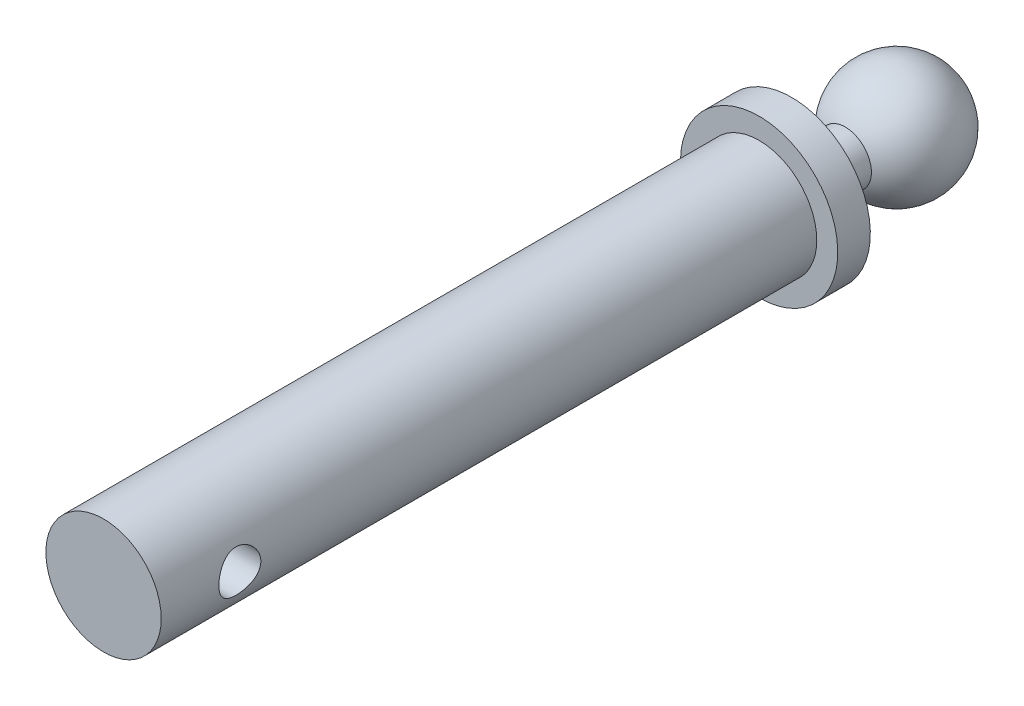
ISO-10303-21;
HEADER;
FILE_DESCRIPTION(('STEP AP214'),'2;1');
FILE_NAME('part.step','',(''),(''),'','','');
FILE_SCHEMA(('AUTOMOTIVE_DESIGN { 1 0 10303 214 1 1 1 1 }'));
ENDSEC;
DATA;
#1=APPLICATION_CONTEXT('core data for automotive mechanical design processes');
#2=APPLICATION_PROTOCOL_DEFINITION('international standard','automotive_design',2000,#1);
#3=PRODUCT_CONTEXT('',#1,'mechanical');
#4=PRODUCT('Part','Part','',(#3));
#5=PRODUCT_RELATED_PRODUCT_CATEGORY('part','',(#4));
#6=PRODUCT_DEFINITION_FORMATION('','',#4);
#7=PRODUCT_DEFINITION_CONTEXT('part definition',#1,'design');
#8=PRODUCT_DEFINITION('design','',#6,#7);
#9=PRODUCT_DEFINITION_SHAPE('','',#8);
#10=(LENGTH_UNIT() NAMED_UNIT(*) SI_UNIT(.MILLI.,.METRE.));
#11=(NAMED_UNIT(*) PLANE_ANGLE_UNIT() SI_UNIT($,.RADIAN.));
#12=(NAMED_UNIT(*) SI_UNIT($,.STERADIAN.) SOLID_ANGLE_UNIT());
#13=UNCERTAINTY_MEASURE_WITH_UNIT(LENGTH_MEASURE(1.E-05),#10,'distance_accuracy_value','');
#14=(GEOMETRIC_REPRESENTATION_CONTEXT(3) GLOBAL_UNCERTAINTY_ASSIGNED_CONTEXT((#13)) GLOBAL_UNIT_ASSIGNED_CONTEXT((#10,
#11,#12)) REPRESENTATION_CONTEXT('',''));
#15=CARTESIAN_POINT('',(0.,0.,0.));
#16=DIRECTION('',(0.,0.,1.));
#17=DIRECTION('',(1.,0.,0.));
#18=AXIS2_PLACEMENT_3D('',#15,#16,#17);
#19=CARTESIAN_POINT('',(15.999886669716,0.,-15.));
#20=DIRECTION('',(0.,0.,1.));
#21=DIRECTION('',(1.,0.,0.));
#22=AXIS2_PLACEMENT_3D('',#19,#20,#21);
#23=CYLINDRICAL_SURFACE('',#22,5.49734160658599);
#24=CARTESIAN_POINT('',(10.50254506313,0.,54.));
#25=CARTESIAN_POINT('',(10.5025429943566,-0.108539656669429,54.0000028284123));
#26=CARTESIAN_POINT('',(10.5057880317019,-0.217059412986843,53.9911363838917));
#27=CARTESIAN_POINT('',(10.5184102172522,-0.430868354685417,53.9560385056035));
#28=CARTESIAN_POINT('',(10.5277868878706,-0.536157791004271,53.9298084242699));
#29=CARTESIAN_POINT('',(10.5516623508866,-0.740392435246265,53.8610251958653));
#30=CARTESIAN_POINT('',(10.5661516191594,-0.839349038237829,53.8185023875287));
#31=CARTESIAN_POINT('',(10.5987993246872,-1.02872018470265,53.7184903155811));
#32=CARTESIAN_POINT('',(10.6169586813099,-1.1191325794819,53.6609973008473));
#33=CARTESIAN_POINT('',(10.655880264378,-1.29249508548054,53.5302512106061));
#34=CARTESIAN_POINT('',(10.6767131184469,-1.37505439480466,53.4565011544369));
#35=CARTESIAN_POINT('',(10.7182751105235,-1.52694349047472,53.2963897399604));
#36=CARTESIAN_POINT('',(10.7390042178535,-1.59626956562931,53.2100248558422));
#37=CARTESIAN_POINT('',(10.7788207052266,-1.72213703865864,53.0234013303315));
#38=CARTESIAN_POINT('',(10.7978239547841,-1.77813877488269,52.9227589877727));
#39=CARTESIAN_POINT('',(10.830945126144,-1.87224882512346,52.7126829643935));
#40=CARTESIAN_POINT('',(10.8450648684426,-1.91036380894075,52.6032525784062));
#41=CARTESIAN_POINT('',(10.8660684582763,-1.96609672965778,52.3831927072172));
#42=CARTESIAN_POINT('',(10.8732133681826,-1.98445704576431,52.2727769682194));
#43=CARTESIAN_POINT('',(10.8802247743098,-2.00248087484638,52.0502184266828));
#44=CARTESIAN_POINT('',(10.8800940540233,-2.0021515380619,51.938076301036));
#45=CARTESIAN_POINT('',(10.8727951015723,-1.98337546616408,51.721905900947));
#46=CARTESIAN_POINT('',(10.8660199635247,-1.96594069170887,51.6177740400326));
#47=CARTESIAN_POINT('',(10.8468460443553,-1.91511541932815,51.414029975602));
#48=CARTESIAN_POINT('',(10.8344464664905,-1.88172266080193,51.3144184146192));
#49=CARTESIAN_POINT('',(10.8051723268076,-1.7993447038121,51.1204148778442));
#50=CARTESIAN_POINT('',(10.7882204412828,-1.75008683314372,51.0261508635764));
#51=CARTESIAN_POINT('',(10.751779340494,-1.63756664326098,50.8469255531895));
#52=CARTESIAN_POINT('',(10.7322892874441,-1.57429969514881,50.7619673458083));
#53=CARTESIAN_POINT('',(10.6914700084845,-1.43086339924239,50.5981389998783));
#54=CARTESIAN_POINT('',(10.6701022463664,-1.3498806598602,50.5199889452113));
#55=CARTESIAN_POINT('',(10.6289951717084,-1.17570714927012,50.3781718876792));
#56=CARTESIAN_POINT('',(10.6092560811105,-1.08251471868845,50.3145068566442));
#57=CARTESIAN_POINT('',(10.5732780419105,-0.884817531437046,50.2027347474015));
#58=CARTESIAN_POINT('',(10.5570911121871,-0.780174503418696,50.1548543126933));
#59=CARTESIAN_POINT('',(10.5304244369436,-0.563584738328622,50.0776118637954));
#60=CARTESIAN_POINT('',(10.5199423119597,-0.451641068192758,50.0482421280175));
#61=CARTESIAN_POINT('',(10.5062778847024,-0.229698095821635,50.0102086011579));
#62=CARTESIAN_POINT('',(10.5027537423037,-0.119885984041274,50.000574255827));
#63=CARTESIAN_POINT('',(10.5023546783467,0.0998289358325469,49.9994760298403));
#64=CARTESIAN_POINT('',(10.5054783842839,0.209731720522961,50.0080083985132));
#65=CARTESIAN_POINT('',(10.5177981970958,0.422400956059388,50.042254515487));
#66=CARTESIAN_POINT('',(10.5267734278354,0.525282091538773,50.0673437024432));
#67=CARTESIAN_POINT('',(10.5496728158873,0.725311416185955,50.1331805600798));
#68=CARTESIAN_POINT('',(10.5635976168762,0.822458857787527,50.1739302674187));
#69=CARTESIAN_POINT('',(10.5955068479953,1.01138002825783,50.271207695848));
#70=CARTESIAN_POINT('',(10.6135962382862,1.10291978574578,50.3281543449759));
#71=CARTESIAN_POINT('',(10.6518185719837,1.2754422419586,50.455730907246));
#72=CARTESIAN_POINT('',(10.6719522357587,1.35642119610525,50.5263656518715));
#73=CARTESIAN_POINT('',(10.7134004359674,1.51013620154147,50.6838525553857));
#74=CARTESIAN_POINT('',(10.734719495575,1.58218194205206,50.7713790322767));
#75=CARTESIAN_POINT('',(10.7750545787504,1.71068525508948,50.9577124222632));
#76=CARTESIAN_POINT('',(10.7940704572184,1.76714184578949,51.0565200453077));
#77=CARTESIAN_POINT('',(10.8275301854466,1.86281552433303,51.2631795290849));
#78=CARTESIAN_POINT('',(10.8419641792574,1.90199551848205,51.3710502636819));
#79=CARTESIAN_POINT('',(10.8642559447401,1.96139950870546,51.5925237224052));
#80=CARTESIAN_POINT('',(10.872117462458,1.98163430356818,51.7061231422073));
#81=CARTESIAN_POINT('',(10.8798958533841,2.00164003192763,51.9283994727454));
#82=CARTESIAN_POINT('',(10.8802662349218,2.00257916994445,52.0369563267278));
#83=CARTESIAN_POINT('',(10.874171691621,1.98692722003002,52.2525929174176));
#84=CARTESIAN_POINT('',(10.8677073394237,1.97033760072804,52.3596727771121));
#85=CARTESIAN_POINT('',(10.8490387147499,1.92098738469723,52.5663930157993));
#86=CARTESIAN_POINT('',(10.8369942499478,1.88867582700951,52.6661562314409));
#87=CARTESIAN_POINT('',(10.8086066730421,1.80918470708856,52.8589101518952));
#88=CARTESIAN_POINT('',(10.792262506412,1.76200149693418,52.9518991881479));
#89=CARTESIAN_POINT('',(10.7560971927969,1.65135740145436,53.1335283696709));
#90=CARTESIAN_POINT('',(10.7361428259379,1.58719913862767,53.2217168813931));
#91=CARTESIAN_POINT('',(10.695489883331,1.44553272810507,53.3864505650268));
#92=CARTESIAN_POINT('',(10.6747910798284,1.36802046688721,53.4629921355303));
#93=CARTESIAN_POINT('',(10.6337456067565,1.19723477764834,53.6061272894283));
#94=CARTESIAN_POINT('',(10.6134675877014,1.10336940985741,53.6720372362874));
#95=CARTESIAN_POINT('',(10.5766459051904,0.905190512276888,53.7871081841087));
#96=CARTESIAN_POINT('',(10.5601021658788,0.800877194782135,53.8362695253012));
#97=CARTESIAN_POINT('',(10.5323839242693,0.58264989979987,53.9168434525605));
#98=CARTESIAN_POINT('',(10.5213147350447,0.468593704444825,53.9479098140309));
#99=CARTESIAN_POINT('',(10.5063979789356,0.236349281522424,53.9894821398312));
#100=CARTESIAN_POINT('',(10.5025473153222,0.118162847992639,53.9999969208189));
#101=CARTESIAN_POINT('',(10.50254506313,0.,54.));
#102=B_SPLINE_CURVE_WITH_KNOTS('',3,(#24,#25,#26,#27,#28,#29,#30,#31,#32,#33,#34,#35,#36,#37,
#38,#39,#40,#41,#42,#43,#44,#45,#46,#47,#48,#49,#50,#51,#52,#53,#54,#55,#56,#57,#58,#59,#60,#61,
#62,#63,#64,#65,#66,#67,#68,#69,#70,#71,#72,#73,#74,#75,#76,#77,#78,#79,#80,#81,#82,#83,#84,#85,
#86,#87,#88,#89,#90,#91,#92,#93,#94,#95,#96,#97,#98,#99,#100,#101),.UNSPECIFIED.,.T.,.F.,(4,2,2,
2,2,2,2,2,2,2,2,2,2,2,2,2,2,2,2,2,2,2,2,2,2,2,2,2,2,2,2,2,2,2,2,2,2,2,4),(0.,0.32518339338616,
0.650341461587573,0.974896971696457,1.29953388489997,1.63597329174188,1.97250691307935,
2.32095776953939,2.66927858852726,3.00399566718351,3.3385846914928,3.65450393584897,
3.97046794645229,4.29218142111711,4.61400135581963,4.95608322691892,5.29821163741472,
5.64505785101479,5.99175928459946,6.32095612221172,6.65008500094956,6.96745821275735,
7.28487271308662,7.61138907821069,7.9380209043398,8.28246458898187,8.62692996223103,
8.97213136049428,9.31713587350437,9.64118705854973,9.96521109544556,10.2804802406477,
10.5958267796163,10.9269802710151,11.2582359528368,11.6059580044031,11.9536729919396,
12.3078393120494,12.6618536609197),.UNSPECIFIED.);
#103=CARTESIAN_POINT('',(10.50254506313,0.,54.));
#104=VERTEX_POINT('',#103);
#105=EDGE_CURVE('E71',#104,#104,#102,.T.);
#106=ORIENTED_EDGE('',*,*,#105,.T.);
#107=EDGE_LOOP('',(#106));
#108=FACE_BOUND('',#107,.T.);
#109=CARTESIAN_POINT('',(21.497228276302,0.,54.));
#110=CARTESIAN_POINT('',(21.4972303450754,0.108539656669392,54.0000028284123));
#111=CARTESIAN_POINT('',(21.4939853077301,0.217059412986805,53.9911363838917));
#112=CARTESIAN_POINT('',(21.4813631221799,0.430868354685379,53.9560385056035));
#113=CARTESIAN_POINT('',(21.4719864515615,0.536157791004233,53.9298084242699));
#114=CARTESIAN_POINT('',(21.4481109885454,0.740392435246227,53.8610251958653));
#115=CARTESIAN_POINT('',(21.4336217202726,0.839349038237791,53.8185023875287));
#116=CARTESIAN_POINT('',(21.4009740147449,1.02872018470262,53.7184903155811));
#117=CARTESIAN_POINT('',(21.3828146581222,1.11913257948187,53.6609973008473));
#118=CARTESIAN_POINT('',(21.343893075054,1.29249508548051,53.5302512106061));
#119=CARTESIAN_POINT('',(21.3230602209852,1.37505439480463,53.4565011544369));
#120=CARTESIAN_POINT('',(21.2814982289086,1.52694349047469,53.2963897399604));
#121=CARTESIAN_POINT('',(21.2607691215785,1.59626956562927,53.2100248558422));
#122=CARTESIAN_POINT('',(21.2209526342055,1.72213703865861,53.0234013303315));
#123=CARTESIAN_POINT('',(21.201949384648,1.77813877488265,52.9227589877727));
#124=CARTESIAN_POINT('',(21.1688282132881,1.87224882512342,52.7126829643935));
#125=CARTESIAN_POINT('',(21.1547084709894,1.91036380894071,52.6032525784062));
#126=CARTESIAN_POINT('',(21.1337048811557,1.96609672965774,52.3831927072172));
#127=CARTESIAN_POINT('',(21.1265599712495,1.98445704576427,52.2727769682194));
#128=CARTESIAN_POINT('',(21.1195485651222,2.00248087484634,52.0502184266828));
#129=CARTESIAN_POINT('',(21.1196792854087,2.00215153806186,51.938076301036));
#130=CARTESIAN_POINT('',(21.1269782378597,1.98337546616404,51.721905900947));
#131=CARTESIAN_POINT('',(21.1337533759073,1.96594069170884,51.6177740400326));
#132=CARTESIAN_POINT('',(21.1529272950768,1.91511541932811,51.414029975602));
#133=CARTESIAN_POINT('',(21.1653268729415,1.88172266080189,51.3144184146192));
#134=CARTESIAN_POINT('',(21.1946010126245,1.79934470381206,51.1204148778442));
#135=CARTESIAN_POINT('',(21.2115528981492,1.75008683314368,51.0261508635764));
#136=CARTESIAN_POINT('',(21.247993998938,1.63756664326094,50.8469255531895));
#137=CARTESIAN_POINT('',(21.2674840519879,1.57429969514877,50.7619673458083));
#138=CARTESIAN_POINT('',(21.3083033309476,1.43086339924235,50.5981389998783));
#139=CARTESIAN_POINT('',(21.3296710930657,1.34988065986016,50.5199889452113));
#140=CARTESIAN_POINT('',(21.3707781677237,1.17570714927008,50.3781718876792));
#141=CARTESIAN_POINT('',(21.3905172583215,1.08251471868841,50.3145068566442));
#142=CARTESIAN_POINT('',(21.4264952975215,0.884817531437006,50.2027347474015));
#143=CARTESIAN_POINT('',(21.4426822272449,0.780174503418654,50.1548543126933));
#144=CARTESIAN_POINT('',(21.4693489024885,0.56358473832858,50.0776118637954));
#145=CARTESIAN_POINT('',(21.4798310274723,0.451641068192718,50.0482421280175));
#146=CARTESIAN_POINT('',(21.4934954547297,0.229698095821595,50.0102086011579));
#147=CARTESIAN_POINT('',(21.4970195971283,0.119885984041235,50.000574255827));
#148=CARTESIAN_POINT('',(21.4974186610853,-0.0998289358325867,49.9994760298403));
#149=CARTESIAN_POINT('',(21.4942949551481,-0.209731720523001,50.0080083985132));
#150=CARTESIAN_POINT('',(21.4819751423362,-0.422400956059428,50.042254515487));
#151=CARTESIAN_POINT('',(21.4729999115967,-0.525282091538812,50.0673437024433));
#152=CARTESIAN_POINT('',(21.4501005235447,-0.725311416185994,50.1331805600798));
#153=CARTESIAN_POINT('',(21.4361757225559,-0.822458857787567,50.1739302674187));
#154=CARTESIAN_POINT('',(21.4042664914368,-1.01138002825787,50.271207695848));
#155=CARTESIAN_POINT('',(21.3861771011458,-1.10291978574582,50.3281543449759));
#156=CARTESIAN_POINT('',(21.3479547674484,-1.27544224195863,50.455730907246));
#157=CARTESIAN_POINT('',(21.3278211036733,-1.35642119610529,50.5263656518715));
#158=CARTESIAN_POINT('',(21.2863729034646,-1.51013620154151,50.6838525553857));
#159=CARTESIAN_POINT('',(21.2650538438571,-1.58218194205211,50.7713790322767));
#160=CARTESIAN_POINT('',(21.2247187606816,-1.71068525508952,50.9577124222632));
#161=CARTESIAN_POINT('',(21.2057028822137,-1.76714184578954,51.0565200453077));
#162=CARTESIAN_POINT('',(21.1722431539854,-1.86281552433307,51.2631795290849));
#163=CARTESIAN_POINT('',(21.1578091601747,-1.90199551848209,51.3710502636819));
#164=CARTESIAN_POINT('',(21.135517394692,-1.9613995087055,51.5925237224052));
#165=CARTESIAN_POINT('',(21.127655876974,-1.98163430356822,51.7061231422073));
#166=CARTESIAN_POINT('',(21.119877486048,-2.00164003192767,51.9283994727454));
#167=CARTESIAN_POINT('',(21.1195071045102,-2.00257916994449,52.0369563267278));
#168=CARTESIAN_POINT('',(21.1256016478111,-1.98692722003005,52.2525929174176));
#169=CARTESIAN_POINT('',(21.1320660000084,-1.97033760072807,52.3596727771121));
#170=CARTESIAN_POINT('',(21.1507346246821,-1.92098738469727,52.5663930157993));
#171=CARTESIAN_POINT('',(21.1627790894843,-1.88867582700955,52.6661562314409));
#172=CARTESIAN_POINT('',(21.19116666639,-1.8091847070886,52.8589101518952));
#173=CARTESIAN_POINT('',(21.2075108330201,-1.76200149693422,52.9518991881479));
#174=CARTESIAN_POINT('',(21.2436761466352,-1.6513574014544,53.1335283696709));
#175=CARTESIAN_POINT('',(21.2636305134941,-1.5871991386277,53.2217168813931));
#176=CARTESIAN_POINT('',(21.304283456101,-1.4455327281051,53.3864505650268));
#177=CARTESIAN_POINT('',(21.3249822596036,-1.36802046688724,53.4629921355303));
#178=CARTESIAN_POINT('',(21.3660277326756,-1.19723477764838,53.6061272894283));
#179=CARTESIAN_POINT('',(21.3863057517306,-1.10336940985745,53.6720372362874));
#180=CARTESIAN_POINT('',(21.4231274342416,-0.905190512276924,53.7871081841087));
#181=CARTESIAN_POINT('',(21.4396711735532,-0.80087719478217,53.8362695253012));
#182=CARTESIAN_POINT('',(21.4673894151627,-0.582649899799906,53.9168434525605));
#183=CARTESIAN_POINT('',(21.4784586043873,-0.468593704444862,53.9479098140309));
#184=CARTESIAN_POINT('',(21.4933753604965,-0.236349281522462,53.9894821398312));
#185=CARTESIAN_POINT('',(21.4972260241099,-0.118162847992677,53.9999969208189));
#186=CARTESIAN_POINT('',(21.497228276302,0.,54.));
#187=B_SPLINE_CURVE_WITH_KNOTS('',3,(#109,#110,#111,#112,#113,#114,#115,#116,#117,#118,#119,
#120,#121,#122,#123,#124,#125,#126,#127,#128,#129,#130,#131,#132,#133,#134,#135,#136,#137,#138,
#139,#140,#141,#142,#143,#144,#145,#146,#147,#148,#149,#150,#151,#152,#153,#154,#155,#156,#157,
#158,#159,#160,#161,#162,#163,#164,#165,#166,#167,#168,#169,#170,#171,#172,#173,#174,#175,#176,
#177,#178,#179,#180,#181,#182,#183,#184,#185,#186),.UNSPECIFIED.,.T.,.F.,(4,2,2,2,2,2,2,2,2,2,2,
2,2,2,2,2,2,2,2,2,2,2,2,2,2,2,2,2,2,2,2,2,2,2,2,2,2,2,4),(0.,0.32518339338616,0.650341461587573,
0.974896971696457,1.29953388489997,1.63597329174189,1.97250691307935,2.32095776953939,
2.66927858852726,3.00399566718351,3.3385846914928,3.65450393584897,3.97046794645229,
4.29218142111711,4.61400135581963,4.95608322691892,5.29821163741472,5.64505785101479,
5.99175928459946,6.32095612221172,6.65008500094956,6.96745821275736,7.28487271308662,
7.61138907821069,7.9380209043398,8.28246458898187,8.62692996223103,8.97213136049428,
9.31713587350437,9.64118705854973,9.96521109544556,10.2804802406477,10.5958267796163,
10.9269802710151,11.2582359528368,11.6059580044031,11.9536729919397,12.3078393120494,
12.6618536609197),.UNSPECIFIED.);
#188=CARTESIAN_POINT('',(21.497228276302,0.,54.));
#189=VERTEX_POINT('',#188);
#190=EDGE_CURVE('E60',#189,#189,#187,.T.);
#191=ORIENTED_EDGE('',*,*,#190,.T.);
#192=EDGE_LOOP('',(#191));
#193=FACE_BOUND('',#192,.T.);
#194=CARTESIAN_POINT('',(15.999886669716,0.,-3.));
#195=DIRECTION('',(0.,0.,-1.));
#196=DIRECTION('',(-1.,0.,0.));
#197=AXIS2_PLACEMENT_3D('',#194,#195,#196);
#198=CIRCLE('',#197,5.49734160658599);
#199=CARTESIAN_POINT('',(10.50254506313,0.,-3.));
#200=VERTEX_POINT('',#199);
#201=EDGE_CURVE('E65',#200,#200,#198,.T.);
#202=ORIENTED_EDGE('',*,*,#201,.F.);
#203=EDGE_LOOP('',(#202));
#204=FACE_BOUND('',#203,.T.);
#205=CARTESIAN_POINT('',(15.999886669716,0.,59.5));
#206=DIRECTION('',(0.,0.,1.));
#207=DIRECTION('',(1.,0.,0.));
#208=AXIS2_PLACEMENT_3D('',#205,#206,#207);
#209=CIRCLE('',#208,5.49734160658599);
#210=CARTESIAN_POINT('',(21.497228276302,0.,59.5));
#211=VERTEX_POINT('',#210);
#212=EDGE_CURVE('E62',#211,#211,#209,.T.);
#213=ORIENTED_EDGE('',*,*,#212,.F.);
#214=EDGE_LOOP('',(#213));
#215=FACE_BOUND('',#214,.T.);
#216=ADVANCED_FACE('F47',(#108,#193,#204,#215),#23,.T.);
#217=CARTESIAN_POINT('',(15.999886669716,0.,-3.));
#218=DIRECTION('',(0.,0.,-1.));
#219=DIRECTION('',(-1.,0.,0.));
#220=AXIS2_PLACEMENT_3D('',#217,#218,#219);
#221=PLANE('',#220);
#222=CARTESIAN_POINT('',(15.999886669716,0.,-3.));
#223=DIRECTION('',(0.,0.,-1.));
#224=DIRECTION('',(-1.,0.,0.));
#225=AXIS2_PLACEMENT_3D('',#222,#223,#224);
#226=CIRCLE('',#225,7.5);
#227=CARTESIAN_POINT('',(8.49988666971603,0.,-3.));
#228=VERTEX_POINT('',#227);
#229=EDGE_CURVE('E68',#228,#228,#226,.T.);
#230=ORIENTED_EDGE('',*,*,#229,.F.);
#231=EDGE_LOOP('',(#230));
#232=FACE_BOUND('',#231,.T.);
#233=ORIENTED_EDGE('',*,*,#201,.T.);
#234=EDGE_LOOP('',(#233));
#235=FACE_BOUND('',#234,.T.);
#236=ADVANCED_FACE('F90',(#232,#235),#221,.F.);
#237=CARTESIAN_POINT('',(15.999886669716,0.,-7.));
#238=DIRECTION('',(0.,0.,1.));
#239=DIRECTION('',(1.,0.,0.));
#240=AXIS2_PLACEMENT_3D('',#237,#238,#239);
#241=CYLINDRICAL_SURFACE('',#240,7.5);
#242=ORIENTED_EDGE('',*,*,#229,.T.);
#243=EDGE_LOOP('',(#242));
#244=FACE_BOUND('',#243,.T.);
#245=CARTESIAN_POINT('',(15.999886669716,0.,-6.10499999999998));
#246=DIRECTION('',(0.,0.,1.));
#247=DIRECTION('',(0.,-1.,0.));
#248=AXIS2_PLACEMENT_3D('',#245,#246,#247);
#249=CIRCLE('',#248,7.5);
#250=CARTESIAN_POINT('',(15.999886669716,-7.50000000000002,-6.10499999999998));
#251=VERTEX_POINT('',#250);
#252=EDGE_CURVE('E55',#251,#251,#249,.T.);
#253=ORIENTED_EDGE('',*,*,#252,.T.);
#254=EDGE_LOOP('',(#253));
#255=FACE_BOUND('',#254,.T.);
#256=ADVANCED_FACE('F85',(#244,#255),#241,.T.);
#257=CARTESIAN_POINT('',(21.497228276302,0.,52.));
#258=DIRECTION('',(-1.,0.,0.));
#259=DIRECTION('',(0.,0.,1.));
#260=AXIS2_PLACEMENT_3D('',#257,#258,#259);
#261=CYLINDRICAL_SURFACE('',#260,2.);
#262=ORIENTED_EDGE('',*,*,#105,.F.);
#263=EDGE_LOOP('',(#262));
#264=FACE_BOUND('',#263,.T.);
#265=ORIENTED_EDGE('',*,*,#190,.F.);
#266=EDGE_LOOP('',(#265));
#267=FACE_BOUND('',#266,.T.);
#268=ADVANCED_FACE('F80',(#264,#267),#261,.F.);
#269=CARTESIAN_POINT('',(15.999886669716,0.,59.5));
#270=DIRECTION('',(0.,0.,1.));
#271=DIRECTION('',(1.,0.,0.));
#272=AXIS2_PLACEMENT_3D('',#269,#270,#271);
#273=PLANE('',#272);
#274=ORIENTED_EDGE('',*,*,#212,.T.);
#275=EDGE_LOOP('',(#274));
#276=FACE_BOUND('',#275,.T.);
#277=ADVANCED_FACE('F84',(#276),#273,.T.);
#278=CARTESIAN_POINT('',(23.499886669716,7.49999999999999,-6.10499999999998));
#279=DIRECTION('',(0.,0.,1.));
#280=DIRECTION('',(0.,-1.,0.));
#281=AXIS2_PLACEMENT_3D('',#278,#279,#280);
#282=PLANE('',#281);
#283=CARTESIAN_POINT('',(15.999886669716,0.,-6.10499999999998));
#284=DIRECTION('',(0.,0.,-1.));
#285=DIRECTION('',(0.,1.,0.));
#286=AXIS2_PLACEMENT_3D('',#283,#284,#285);
#287=CIRCLE('',#286,2.5);
#288=CARTESIAN_POINT('',(15.999886669716,2.49999999999999,-6.10499999999998));
#289=VERTEX_POINT('',#288);
#290=EDGE_CURVE('E10',#289,#289,#287,.T.);
#291=ORIENTED_EDGE('',*,*,#290,.F.);
#292=EDGE_LOOP('',(#291));
#293=FACE_BOUND('',#292,.T.);
#294=ORIENTED_EDGE('',*,*,#252,.F.);
#295=EDGE_LOOP('',(#294));
#296=FACE_BOUND('',#295,.T.);
#297=ADVANCED_FACE('F97',(#293,#296),#282,.F.);
#298=CARTESIAN_POINT('',(15.999886669716,0.,-16.105));
#299=DIRECTION('',(0.,0.,1.));
#300=DIRECTION('',(0.,-1.,0.));
#301=AXIS2_PLACEMENT_3D('',#298,#299,#300);
#302=CYLINDRICAL_SURFACE('',#301,2.5);
#303=CARTESIAN_POINT('',(15.999886669716,0.,-11.2090052349393));
#304=DIRECTION('',(0.,0.,-1.));
#305=DIRECTION('',(0.,1.,0.));
#306=AXIS2_PLACEMENT_3D('',#303,#304,#305);
#307=CIRCLE('',#306,2.5);
#308=CARTESIAN_POINT('',(15.999886669716,2.49999999999999,-11.2090052349393));
#309=VERTEX_POINT('',#308);
#310=EDGE_CURVE('E51',#309,#309,#307,.F.);
#311=ORIENTED_EDGE('',*,*,#310,.T.);
#312=EDGE_LOOP('',(#311));
#313=FACE_BOUND('',#312,.T.);
#314=ORIENTED_EDGE('',*,*,#290,.T.);
#315=EDGE_LOOP('',(#314));
#316=FACE_BOUND('',#315,.T.);
#317=ADVANCED_FACE('F101',(#313,#316),#302,.T.);
#318=CARTESIAN_POINT('',(15.999886669716,0.,-16.105));
#319=DIRECTION('',(0.,1.,0.));
#320=DIRECTION('',(-1.,0.,0.));
#321=AXIS2_PLACEMENT_3D('',#318,#319,#320);
#322=SPHERICAL_SURFACE('',#321,5.49734160658599);
#323=CARTESIAN_POINT('',(15.999886669716,0.,-16.105));
#324=DIRECTION('',(0.,0.,-1.));
#325=DIRECTION('',(0.,1.,0.));
#326=AXIS2_PLACEMENT_3D('',#323,#324,#325);
#327=SPHERICAL_SURFACE('',#326,5.49734160658599);
#328=ORIENTED_EDGE('',*,*,#310,.F.);
#329=EDGE_LOOP('',(#328));
#330=FACE_BOUND('',#329,.T.);
#331=ADVANCED_FACE('F105',(#330),#327,.T.);
#332=CLOSED_SHELL('',(#216,#236,#256,#268,#277,#297,#317,#331));
#333=MANIFOLD_SOLID_BREP('B2',#332);
#334=ADVANCED_BREP_SHAPE_REPRESENTATION('',(#18,#333),#14);
#335=SHAPE_DEFINITION_REPRESENTATION(#9,#334);
ENDSEC;
END-ISO-10303-21;
